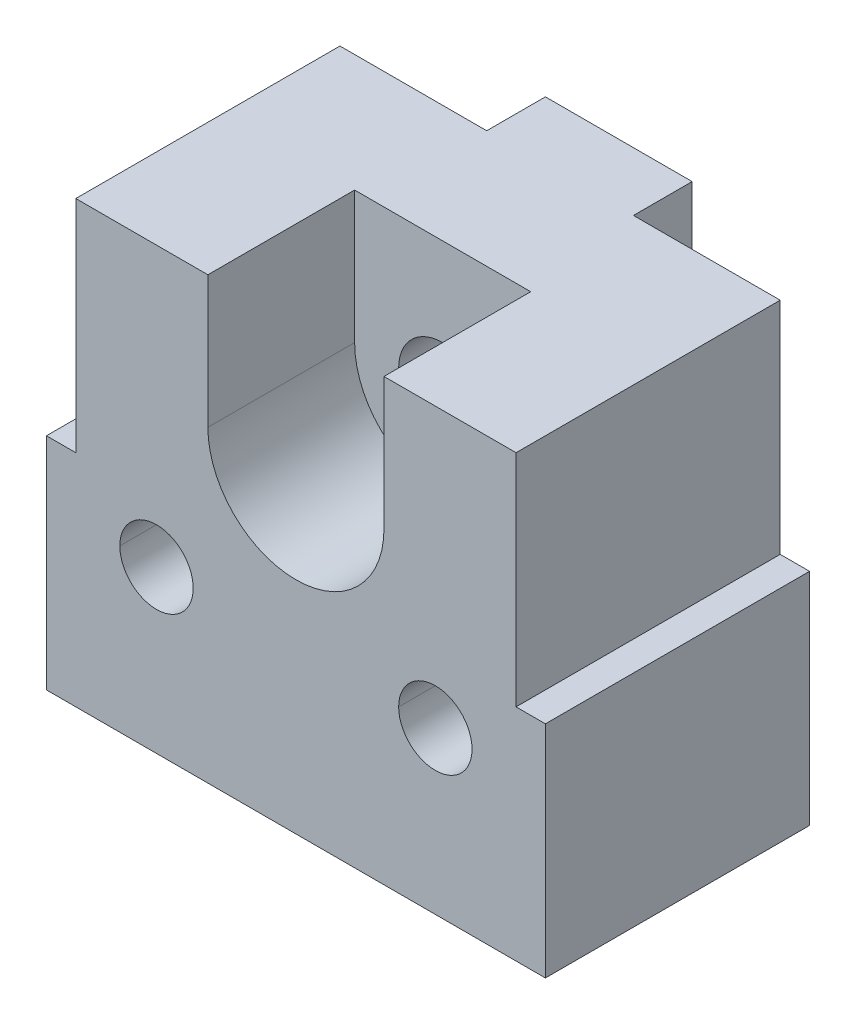
ISO-10303-21;
HEADER;
FILE_DESCRIPTION(('STEP AP214'),'2;1');
FILE_NAME('part.step','',(''),(''),'','','');
FILE_SCHEMA(('AUTOMOTIVE_DESIGN { 1 0 10303 214 1 1 1 1 }'));
ENDSEC;
DATA;
#1=APPLICATION_CONTEXT('core data for automotive mechanical design processes');
#2=APPLICATION_PROTOCOL_DEFINITION('international standard','automotive_design',2000,#1);
#3=PRODUCT_CONTEXT('',#1,'mechanical');
#4=PRODUCT('Part','Part','',(#3));
#5=PRODUCT_RELATED_PRODUCT_CATEGORY('part','',(#4));
#6=PRODUCT_DEFINITION_FORMATION('','',#4);
#7=PRODUCT_DEFINITION_CONTEXT('part definition',#1,'design');
#8=PRODUCT_DEFINITION('design','',#6,#7);
#9=PRODUCT_DEFINITION_SHAPE('','',#8);
#10=(LENGTH_UNIT() NAMED_UNIT(*) SI_UNIT(.MILLI.,.METRE.));
#11=(NAMED_UNIT(*) PLANE_ANGLE_UNIT() SI_UNIT($,.RADIAN.));
#12=(NAMED_UNIT(*) SI_UNIT($,.STERADIAN.) SOLID_ANGLE_UNIT());
#13=UNCERTAINTY_MEASURE_WITH_UNIT(LENGTH_MEASURE(1.E-05),#10,'distance_accuracy_value','');
#14=(GEOMETRIC_REPRESENTATION_CONTEXT(3) GLOBAL_UNCERTAINTY_ASSIGNED_CONTEXT((#13)) GLOBAL_UNIT_ASSIGNED_CONTEXT((#10,
#11,#12)) REPRESENTATION_CONTEXT('',''));
#15=CARTESIAN_POINT('',(0.,0.,0.));
#16=DIRECTION('',(0.,0.,1.));
#17=DIRECTION('',(1.,0.,0.));
#18=AXIS2_PLACEMENT_3D('',#15,#16,#17);
#19=CARTESIAN_POINT('',(0.,10.5,-9.));
#20=DIRECTION('',(0.,0.,1.));
#21=DIRECTION('',(1.,0.,0.));
#22=AXIS2_PLACEMENT_3D('',#19,#20,#21);
#23=CYLINDRICAL_SURFACE('',#22,1.5);
#24=CARTESIAN_POINT('',(0.,10.5,-11.));
#25=DIRECTION('',(0.,0.,1.));
#26=DIRECTION('',(1.,0.,0.));
#27=AXIS2_PLACEMENT_3D('',#24,#25,#26);
#28=CIRCLE('',#27,1.5);
#29=CARTESIAN_POINT('',(1.5,10.5,-11.));
#30=VERTEX_POINT('',#29);
#31=CARTESIAN_POINT('',(-1.5,10.5,-11.));
#32=VERTEX_POINT('',#31);
#33=EDGE_CURVE('E339',#30,#32,#28,.T.);
#34=ORIENTED_EDGE('',*,*,#33,.F.);
#35=DIRECTION('',(0.,0.,1.));
#36=VECTOR('',#35,1.);
#37=CARTESIAN_POINT('',(1.5,10.5,-9.));
#38=LINE('',#37,#36);
#39=CARTESIAN_POINT('',(1.5,10.5,-5.));
#40=VERTEX_POINT('',#39);
#41=EDGE_CURVE('E86',#30,#40,#38,.T.);
#42=ORIENTED_EDGE('',*,*,#41,.T.);
#43=CARTESIAN_POINT('',(0.,10.5,-5.));
#44=DIRECTION('',(0.,0.,1.));
#45=DIRECTION('',(1.,0.,0.));
#46=AXIS2_PLACEMENT_3D('',#43,#44,#45);
#47=CIRCLE('',#46,1.5);
#48=CARTESIAN_POINT('',(-1.5,10.5,-5.));
#49=VERTEX_POINT('',#48);
#50=EDGE_CURVE('E99',#49,#40,#47,.F.);
#51=ORIENTED_EDGE('',*,*,#50,.F.);
#52=DIRECTION('',(0.,0.,1.));
#53=VECTOR('',#52,1.);
#54=CARTESIAN_POINT('',(-1.5,10.5,-9.));
#55=LINE('',#54,#53);
#56=EDGE_CURVE('E91',#49,#32,#55,.F.);
#57=ORIENTED_EDGE('',*,*,#56,.T.);
#58=EDGE_LOOP('',(#34,#42,#51,#57));
#59=FACE_BOUND('',#58,.T.);
#60=ADVANCED_FACE('F17',(#59),#23,.F.);
#61=CARTESIAN_POINT('',(0.,10.5,-9.));
#62=DIRECTION('',(0.,0.,1.));
#63=DIRECTION('',(1.,0.,0.));
#64=AXIS2_PLACEMENT_3D('',#61,#62,#63);
#65=CYLINDRICAL_SURFACE('',#64,1.5);
#66=ORIENTED_EDGE('',*,*,#56,.F.);
#67=CARTESIAN_POINT('',(0.,10.5,-5.));
#68=DIRECTION('',(0.,0.,1.));
#69=DIRECTION('',(1.,0.,0.));
#70=AXIS2_PLACEMENT_3D('',#67,#68,#69);
#71=CIRCLE('',#70,1.5);
#72=EDGE_CURVE('E20',#40,#49,#71,.F.);
#73=ORIENTED_EDGE('',*,*,#72,.F.);
#74=ORIENTED_EDGE('',*,*,#41,.F.);
#75=CARTESIAN_POINT('',(0.,10.5,-11.));
#76=DIRECTION('',(0.,0.,1.));
#77=DIRECTION('',(1.,0.,0.));
#78=AXIS2_PLACEMENT_3D('',#75,#76,#77);
#79=CIRCLE('',#78,1.5);
#80=EDGE_CURVE('E96',#32,#30,#79,.T.);
#81=ORIENTED_EDGE('',*,*,#80,.F.);
#82=EDGE_LOOP('',(#66,#73,#74,#81));
#83=FACE_BOUND('',#82,.T.);
#84=ADVANCED_FACE('F92',(#83),#65,.F.);
#85=CARTESIAN_POINT('',(0.,10.5,-5.));
#86=DIRECTION('',(0.,0.,1.));
#87=DIRECTION('',(1.,0.,0.));
#88=AXIS2_PLACEMENT_3D('',#85,#86,#87);
#89=PLANE('',#88);
#90=DIRECTION('',(0.,1.,0.));
#91=VECTOR('',#90,1.);
#92=CARTESIAN_POINT('',(-3.,15.,-5.));
#93=LINE('',#92,#91);
#94=CARTESIAN_POINT('',(-3.,10.5,-5.));
#95=VERTEX_POINT('',#94);
#96=CARTESIAN_POINT('',(-3.,15.,-5.));
#97=VERTEX_POINT('',#96);
#98=EDGE_CURVE('E265',#95,#97,#93,.T.);
#99=ORIENTED_EDGE('',*,*,#98,.F.);
#100=CARTESIAN_POINT('',(0.,10.5,-5.));
#101=DIRECTION('',(0.,0.,1.));
#102=DIRECTION('',(1.,0.,0.));
#103=AXIS2_PLACEMENT_3D('',#100,#101,#102);
#104=CIRCLE('',#103,3.);
#105=CARTESIAN_POINT('',(3.,10.5,-5.));
#106=VERTEX_POINT('',#105);
#107=EDGE_CURVE('E280',#95,#106,#104,.T.);
#108=ORIENTED_EDGE('',*,*,#107,.T.);
#109=DIRECTION('',(0.,1.,0.));
#110=VECTOR('',#109,1.);
#111=CARTESIAN_POINT('',(3.,10.5,-5.));
#112=LINE('',#111,#110);
#113=CARTESIAN_POINT('',(3.,15.,-5.));
#114=VERTEX_POINT('',#113);
#115=EDGE_CURVE('E328',#114,#106,#112,.F.);
#116=ORIENTED_EDGE('',*,*,#115,.F.);
#117=DIRECTION('',(1.,0.,0.));
#118=VECTOR('',#117,1.);
#119=CARTESIAN_POINT('',(7.5,15.,-5.));
#120=LINE('',#119,#118);
#121=EDGE_CURVE('E275',#97,#114,#120,.T.);
#122=ORIENTED_EDGE('',*,*,#121,.F.);
#123=EDGE_LOOP('',(#99,#108,#116,#122));
#124=FACE_BOUND('',#123,.T.);
#125=ORIENTED_EDGE('',*,*,#72,.T.);
#126=ORIENTED_EDGE('',*,*,#50,.T.);
#127=EDGE_LOOP('',(#125,#126));
#128=FACE_BOUND('',#127,.T.);
#129=ADVANCED_FACE('F102',(#124,#128),#89,.T.);
#130=CARTESIAN_POINT('',(-7.5,7.50000000000001,-9.));
#131=DIRECTION('',(0.,1.,0.));
#132=DIRECTION('',(0.,0.,1.));
#133=AXIS2_PLACEMENT_3D('',#130,#131,#132);
#134=PLANE('',#133);
#135=DIRECTION('',(1.,0.,0.));
#136=VECTOR('',#135,1.);
#137=CARTESIAN_POINT('',(-7.5,7.50000000000001,0.));
#138=LINE('',#137,#136);
#139=CARTESIAN_POINT('',(-8.5,7.50000000000001,0.));
#140=VERTEX_POINT('',#139);
#141=CARTESIAN_POINT('',(-7.5,7.50000000000001,0.));
#142=VERTEX_POINT('',#141);
#143=EDGE_CURVE('E101',#140,#142,#138,.T.);
#144=ORIENTED_EDGE('',*,*,#143,.T.);
#145=DIRECTION('',(0.,0.,1.));
#146=VECTOR('',#145,1.);
#147=CARTESIAN_POINT('',(-7.5,7.50000000000001,-9.));
#148=LINE('',#147,#146);
#149=CARTESIAN_POINT('',(-7.5,7.50000000000001,-9.));
#150=VERTEX_POINT('',#149);
#151=EDGE_CURVE('E248',#150,#142,#148,.T.);
#152=ORIENTED_EDGE('',*,*,#151,.F.);
#153=DIRECTION('',(1.,0.,0.));
#154=VECTOR('',#153,1.);
#155=CARTESIAN_POINT('',(8.5,7.50000000000001,-9.));
#156=LINE('',#155,#154);
#157=CARTESIAN_POINT('',(-8.5,7.50000000000001,-9.));
#158=VERTEX_POINT('',#157);
#159=EDGE_CURVE('E307',#150,#158,#156,.F.);
#160=ORIENTED_EDGE('',*,*,#159,.T.);
#161=DIRECTION('',(0.,0.,1.));
#162=VECTOR('',#161,1.);
#163=CARTESIAN_POINT('',(-8.5,7.50000000000001,-9.));
#164=LINE('',#163,#162);
#165=EDGE_CURVE('E239',#140,#158,#164,.F.);
#166=ORIENTED_EDGE('',*,*,#165,.F.);
#167=EDGE_LOOP('',(#144,#152,#160,#166));
#168=FACE_BOUND('',#167,.T.);
#169=ADVANCED_FACE('F104',(#168),#134,.T.);
#170=CARTESIAN_POINT('',(-2.5,15.,-11.));
#171=DIRECTION('',(1.,0.,0.));
#172=DIRECTION('',(0.,1.,0.));
#173=AXIS2_PLACEMENT_3D('',#170,#171,#172);
#174=PLANE('',#173);
#175=DIRECTION('',(0.,1.,0.));
#176=VECTOR('',#175,1.);
#177=CARTESIAN_POINT('',(-2.5,0.,-11.));
#178=LINE('',#177,#176);
#179=CARTESIAN_POINT('',(-2.5,0.,-11.));
#180=VERTEX_POINT('',#179);
#181=CARTESIAN_POINT('',(-2.5,15.,-11.));
#182=VERTEX_POINT('',#181);
#183=EDGE_CURVE('E204',#180,#182,#178,.T.);
#184=ORIENTED_EDGE('',*,*,#183,.F.);
#185=DIRECTION('',(0.,0.,-1.));
#186=VECTOR('',#185,1.);
#187=CARTESIAN_POINT('',(-2.5,0.,-9.));
#188=LINE('',#187,#186);
#189=CARTESIAN_POINT('',(-2.5,0.,-9.));
#190=VERTEX_POINT('',#189);
#191=EDGE_CURVE('E209',#190,#180,#188,.T.);
#192=ORIENTED_EDGE('',*,*,#191,.F.);
#193=DIRECTION('',(0.,1.,0.));
#194=VECTOR('',#193,1.);
#195=CARTESIAN_POINT('',(-2.5,7.50000000000001,-9.));
#196=LINE('',#195,#194);
#197=CARTESIAN_POINT('',(-2.5,15.,-9.));
#198=VERTEX_POINT('',#197);
#199=EDGE_CURVE('E311',#190,#198,#196,.T.);
#200=ORIENTED_EDGE('',*,*,#199,.T.);
#201=DIRECTION('',(0.,0.,1.));
#202=VECTOR('',#201,1.);
#203=CARTESIAN_POINT('',(-2.5,15.,-9.));
#204=LINE('',#203,#202);
#205=EDGE_CURVE('E213',#182,#198,#204,.T.);
#206=ORIENTED_EDGE('',*,*,#205,.F.);
#207=EDGE_LOOP('',(#184,#192,#200,#206));
#208=FACE_BOUND('',#207,.T.);
#209=ADVANCED_FACE('F112',(#208),#174,.F.);
#210=CARTESIAN_POINT('',(2.5,0.,-11.));
#211=DIRECTION('',(0.,0.,-1.));
#212=DIRECTION('',(-1.,0.,0.));
#213=AXIS2_PLACEMENT_3D('',#210,#211,#212);
#214=PLANE('',#213);
#215=DIRECTION('',(0.,-1.,0.));
#216=VECTOR('',#215,1.);
#217=CARTESIAN_POINT('',(2.5,15.,-11.));
#218=LINE('',#217,#216);
#219=CARTESIAN_POINT('',(2.5,15.,-11.));
#220=VERTEX_POINT('',#219);
#221=CARTESIAN_POINT('',(2.5,0.,-11.));
#222=VERTEX_POINT('',#221);
#223=EDGE_CURVE('E218',#220,#222,#218,.T.);
#224=ORIENTED_EDGE('',*,*,#223,.T.);
#225=DIRECTION('',(1.,0.,0.));
#226=VECTOR('',#225,1.);
#227=CARTESIAN_POINT('',(8.5,0.,-11.));
#228=LINE('',#227,#226);
#229=EDGE_CURVE('E222',#180,#222,#228,.T.);
#230=ORIENTED_EDGE('',*,*,#229,.F.);
#231=ORIENTED_EDGE('',*,*,#183,.T.);
#232=DIRECTION('',(1.,0.,0.));
#233=VECTOR('',#232,1.);
#234=CARTESIAN_POINT('',(7.5,15.,-11.));
#235=LINE('',#234,#233);
#236=EDGE_CURVE('E255',#220,#182,#235,.F.);
#237=ORIENTED_EDGE('',*,*,#236,.F.);
#238=EDGE_LOOP('',(#224,#230,#231,#237));
#239=FACE_BOUND('',#238,.T.);
#240=ORIENTED_EDGE('',*,*,#33,.T.);
#241=ORIENTED_EDGE('',*,*,#80,.T.);
#242=EDGE_LOOP('',(#240,#241));
#243=FACE_BOUND('',#242,.T.);
#244=ADVANCED_FACE('F190',(#239,#243),#214,.T.);
#245=CARTESIAN_POINT('',(2.5,15.,-11.));
#246=DIRECTION('',(-1.,0.,0.));
#247=DIRECTION('',(0.,-1.,0.));
#248=AXIS2_PLACEMENT_3D('',#245,#246,#247);
#249=PLANE('',#248);
#250=ORIENTED_EDGE('',*,*,#223,.F.);
#251=DIRECTION('',(0.,0.,1.));
#252=VECTOR('',#251,1.);
#253=CARTESIAN_POINT('',(2.5,15.,-9.));
#254=LINE('',#253,#252);
#255=CARTESIAN_POINT('',(2.5,15.,-9.));
#256=VERTEX_POINT('',#255);
#257=EDGE_CURVE('E257',#256,#220,#254,.F.);
#258=ORIENTED_EDGE('',*,*,#257,.F.);
#259=DIRECTION('',(0.,1.,0.));
#260=VECTOR('',#259,1.);
#261=CARTESIAN_POINT('',(2.5,7.50000000000001,-9.));
#262=LINE('',#261,#260);
#263=CARTESIAN_POINT('',(2.5,0.,-9.));
#264=VERTEX_POINT('',#263);
#265=EDGE_CURVE('E310',#256,#264,#262,.F.);
#266=ORIENTED_EDGE('',*,*,#265,.T.);
#267=DIRECTION('',(0.,0.,-1.));
#268=VECTOR('',#267,1.);
#269=CARTESIAN_POINT('',(2.5,0.,-9.));
#270=LINE('',#269,#268);
#271=EDGE_CURVE('E227',#222,#264,#270,.F.);
#272=ORIENTED_EDGE('',*,*,#271,.F.);
#273=EDGE_LOOP('',(#250,#258,#266,#272));
#274=FACE_BOUND('',#273,.T.);
#275=ADVANCED_FACE('F186',(#274),#249,.F.);
#276=CARTESIAN_POINT('',(8.5,7.50000000000001,-9.));
#277=DIRECTION('',(0.,1.,0.));
#278=DIRECTION('',(0.,0.,1.));
#279=AXIS2_PLACEMENT_3D('',#276,#277,#278);
#280=PLANE('',#279);
#281=DIRECTION('',(1.,0.,0.));
#282=VECTOR('',#281,1.);
#283=CARTESIAN_POINT('',(8.5,7.50000000000001,0.));
#284=LINE('',#283,#282);
#285=CARTESIAN_POINT('',(7.5,7.50000000000001,0.));
#286=VERTEX_POINT('',#285);
#287=CARTESIAN_POINT('',(8.5,7.50000000000001,0.));
#288=VERTEX_POINT('',#287);
#289=EDGE_CURVE('E313',#286,#288,#284,.T.);
#290=ORIENTED_EDGE('',*,*,#289,.T.);
#291=DIRECTION('',(0.,0.,-1.));
#292=VECTOR('',#291,1.);
#293=CARTESIAN_POINT('',(8.5,7.50000000000001,-9.));
#294=LINE('',#293,#292);
#295=CARTESIAN_POINT('',(8.5,7.50000000000001,-9.));
#296=VERTEX_POINT('',#295);
#297=EDGE_CURVE('E360',#296,#288,#294,.F.);
#298=ORIENTED_EDGE('',*,*,#297,.F.);
#299=DIRECTION('',(1.,0.,0.));
#300=VECTOR('',#299,1.);
#301=CARTESIAN_POINT('',(8.5,7.50000000000001,-9.));
#302=LINE('',#301,#300);
#303=CARTESIAN_POINT('',(7.5,7.5,-9.));
#304=VERTEX_POINT('',#303);
#305=EDGE_CURVE('E325',#296,#304,#302,.F.);
#306=ORIENTED_EDGE('',*,*,#305,.T.);
#307=DIRECTION('',(0.,0.,-1.));
#308=VECTOR('',#307,1.);
#309=CARTESIAN_POINT('',(7.5,7.50000000000001,-9.));
#310=LINE('',#309,#308);
#311=EDGE_CURVE('E296',#286,#304,#310,.T.);
#312=ORIENTED_EDGE('',*,*,#311,.F.);
#313=EDGE_LOOP('',(#290,#298,#306,#312));
#314=FACE_BOUND('',#313,.T.);
#315=ADVANCED_FACE('F182',(#314),#280,.T.);
#316=CARTESIAN_POINT('',(8.5,7.50000000000001,-9.));
#317=DIRECTION('',(0.,0.,1.));
#318=DIRECTION('',(1.,0.,0.));
#319=AXIS2_PLACEMENT_3D('',#316,#317,#318);
#320=PLANE('',#319);
#321=CARTESIAN_POINT('',(-4.75,5.50000000000001,-9.));
#322=DIRECTION('',(0.,0.,1.));
#323=DIRECTION('',(1.,0.,0.));
#324=AXIS2_PLACEMENT_3D('',#321,#322,#323);
#325=CIRCLE('',#324,1.25);
#326=CARTESIAN_POINT('',(-6.,5.50000000000001,-9.));
#327=VERTEX_POINT('',#326);
#328=CARTESIAN_POINT('',(-3.5,5.50000000000001,-9.));
#329=VERTEX_POINT('',#328);
#330=EDGE_CURVE('E333',#327,#329,#325,.T.);
#331=ORIENTED_EDGE('',*,*,#330,.T.);
#332=CARTESIAN_POINT('',(-4.75,5.50000000000001,-9.));
#333=DIRECTION('',(0.,0.,1.));
#334=DIRECTION('',(1.,0.,0.));
#335=AXIS2_PLACEMENT_3D('',#332,#333,#334);
#336=CIRCLE('',#335,1.25);
#337=EDGE_CURVE('E393',#329,#327,#336,.T.);
#338=ORIENTED_EDGE('',*,*,#337,.T.);
#339=EDGE_LOOP('',(#331,#338));
#340=FACE_BOUND('',#339,.T.);
#341=DIRECTION('',(0.,1.,0.));
#342=VECTOR('',#341,1.);
#343=CARTESIAN_POINT('',(-8.5,0.,-9.));
#344=LINE('',#343,#342);
#345=CARTESIAN_POINT('',(-8.5,0.,-9.));
#346=VERTEX_POINT('',#345);
#347=EDGE_CURVE('E242',#158,#346,#344,.F.);
#348=ORIENTED_EDGE('',*,*,#347,.F.);
#349=ORIENTED_EDGE('',*,*,#159,.F.);
#350=DIRECTION('',(0.,1.,0.));
#351=VECTOR('',#350,1.);
#352=CARTESIAN_POINT('',(-7.5,15.,-9.));
#353=LINE('',#352,#351);
#354=CARTESIAN_POINT('',(-7.5,15.,-9.));
#355=VERTEX_POINT('',#354);
#356=EDGE_CURVE('E251',#355,#150,#353,.F.);
#357=ORIENTED_EDGE('',*,*,#356,.F.);
#358=DIRECTION('',(1.,0.,0.));
#359=VECTOR('',#358,1.);
#360=CARTESIAN_POINT('',(7.5,15.,-9.));
#361=LINE('',#360,#359);
#362=EDGE_CURVE('E258',#198,#355,#361,.F.);
#363=ORIENTED_EDGE('',*,*,#362,.F.);
#364=ORIENTED_EDGE('',*,*,#199,.F.);
#365=DIRECTION('',(1.,0.,0.));
#366=VECTOR('',#365,1.);
#367=CARTESIAN_POINT('',(8.5,0.,-9.));
#368=LINE('',#367,#366);
#369=EDGE_CURVE('E231',#346,#190,#368,.T.);
#370=ORIENTED_EDGE('',*,*,#369,.F.);
#371=EDGE_LOOP('',(#348,#349,#357,#363,#364,#370));
#372=FACE_BOUND('',#371,.T.);
#373=ADVANCED_FACE('F178',(#340,#372),#320,.F.);
#374=CARTESIAN_POINT('',(8.5,7.50000000000001,-9.));
#375=DIRECTION('',(0.,0.,1.));
#376=DIRECTION('',(1.,0.,0.));
#377=AXIS2_PLACEMENT_3D('',#374,#375,#376);
#378=PLANE('',#377);
#379=CARTESIAN_POINT('',(4.75,5.50000000000001,-9.));
#380=DIRECTION('',(0.,0.,1.));
#381=DIRECTION('',(1.,0.,0.));
#382=AXIS2_PLACEMENT_3D('',#379,#380,#381);
#383=CIRCLE('',#382,1.25);
#384=CARTESIAN_POINT('',(3.5,5.50000000000001,-9.));
#385=VERTEX_POINT('',#384);
#386=CARTESIAN_POINT('',(6.,5.50000000000001,-9.));
#387=VERTEX_POINT('',#386);
#388=EDGE_CURVE('E390',#385,#387,#383,.T.);
#389=ORIENTED_EDGE('',*,*,#388,.T.);
#390=CARTESIAN_POINT('',(4.75,5.50000000000001,-9.));
#391=DIRECTION('',(0.,0.,1.));
#392=DIRECTION('',(1.,0.,0.));
#393=AXIS2_PLACEMENT_3D('',#390,#391,#392);
#394=CIRCLE('',#393,1.25);
#395=EDGE_CURVE('E387',#387,#385,#394,.T.);
#396=ORIENTED_EDGE('',*,*,#395,.T.);
#397=EDGE_LOOP('',(#389,#396));
#398=FACE_BOUND('',#397,.T.);
#399=DIRECTION('',(0.,1.,0.));
#400=VECTOR('',#399,1.);
#401=CARTESIAN_POINT('',(7.5,15.,-9.));
#402=LINE('',#401,#400);
#403=CARTESIAN_POINT('',(7.5,15.,-9.));
#404=VERTEX_POINT('',#403);
#405=EDGE_CURVE('E297',#304,#404,#402,.T.);
#406=ORIENTED_EDGE('',*,*,#405,.F.);
#407=ORIENTED_EDGE('',*,*,#305,.F.);
#408=DIRECTION('',(0.,1.,0.));
#409=VECTOR('',#408,1.);
#410=CARTESIAN_POINT('',(8.5,0.,-9.));
#411=LINE('',#410,#409);
#412=CARTESIAN_POINT('',(8.5,0.,-9.));
#413=VERTEX_POINT('',#412);
#414=EDGE_CURVE('E363',#413,#296,#411,.T.);
#415=ORIENTED_EDGE('',*,*,#414,.F.);
#416=DIRECTION('',(1.,0.,0.));
#417=VECTOR('',#416,1.);
#418=CARTESIAN_POINT('',(8.5,0.,-9.));
#419=LINE('',#418,#417);
#420=EDGE_CURVE('E238',#264,#413,#419,.T.);
#421=ORIENTED_EDGE('',*,*,#420,.F.);
#422=ORIENTED_EDGE('',*,*,#265,.F.);
#423=DIRECTION('',(1.,0.,0.));
#424=VECTOR('',#423,1.);
#425=CARTESIAN_POINT('',(7.5,15.,-9.));
#426=LINE('',#425,#424);
#427=EDGE_CURVE('E290',#404,#256,#426,.F.);
#428=ORIENTED_EDGE('',*,*,#427,.F.);
#429=EDGE_LOOP('',(#406,#407,#415,#421,#422,#428));
#430=FACE_BOUND('',#429,.T.);
#431=ADVANCED_FACE('F174',(#398,#430),#378,.F.);
#432=CARTESIAN_POINT('',(3.,10.5,-5.));
#433=DIRECTION('',(-1.,0.,0.));
#434=DIRECTION('',(0.,0.,1.));
#435=AXIS2_PLACEMENT_3D('',#432,#433,#434);
#436=PLANE('',#435);
#437=DIRECTION('',(0.,1.,0.));
#438=VECTOR('',#437,1.);
#439=CARTESIAN_POINT('',(3.,7.50000000000001,0.));
#440=LINE('',#439,#438);
#441=CARTESIAN_POINT('',(3.,15.,0.));
#442=VERTEX_POINT('',#441);
#443=CARTESIAN_POINT('',(3.,10.5,0.));
#444=VERTEX_POINT('',#443);
#445=EDGE_CURVE('E284',#442,#444,#440,.F.);
#446=ORIENTED_EDGE('',*,*,#445,.F.);
#447=DIRECTION('',(0.,0.,1.));
#448=VECTOR('',#447,1.);
#449=CARTESIAN_POINT('',(3.,15.,-9.));
#450=LINE('',#449,#448);
#451=EDGE_CURVE('E287',#114,#442,#450,.T.);
#452=ORIENTED_EDGE('',*,*,#451,.F.);
#453=ORIENTED_EDGE('',*,*,#115,.T.);
#454=DIRECTION('',(0.,0.,1.));
#455=VECTOR('',#454,1.);
#456=CARTESIAN_POINT('',(3.,10.5,-5.));
#457=LINE('',#456,#455);
#458=EDGE_CURVE('E278',#106,#444,#457,.T.);
#459=ORIENTED_EDGE('',*,*,#458,.T.);
#460=EDGE_LOOP('',(#446,#452,#453,#459));
#461=FACE_BOUND('',#460,.T.);
#462=ADVANCED_FACE('F170',(#461),#436,.T.);
#463=CARTESIAN_POINT('',(0.,10.5,-5.));
#464=DIRECTION('',(0.,0.,1.));
#465=DIRECTION('',(1.,0.,0.));
#466=AXIS2_PLACEMENT_3D('',#463,#464,#465);
#467=CYLINDRICAL_SURFACE('',#466,3.);
#468=ORIENTED_EDGE('',*,*,#107,.F.);
#469=DIRECTION('',(0.,0.,1.));
#470=VECTOR('',#469,1.);
#471=CARTESIAN_POINT('',(-3.,10.5,-5.));
#472=LINE('',#471,#470);
#473=CARTESIAN_POINT('',(-3.,10.5,0.));
#474=VERTEX_POINT('',#473);
#475=EDGE_CURVE('E262',#474,#95,#472,.F.);
#476=ORIENTED_EDGE('',*,*,#475,.F.);
#477=CARTESIAN_POINT('',(0.,10.5,0.));
#478=DIRECTION('',(0.,0.,1.));
#479=DIRECTION('',(1.,0.,0.));
#480=AXIS2_PLACEMENT_3D('',#477,#478,#479);
#481=CIRCLE('',#480,3.);
#482=EDGE_CURVE('E384',#444,#474,#481,.F.);
#483=ORIENTED_EDGE('',*,*,#482,.F.);
#484=ORIENTED_EDGE('',*,*,#458,.F.);
#485=EDGE_LOOP('',(#468,#476,#483,#484));
#486=FACE_BOUND('',#485,.T.);
#487=ADVANCED_FACE('F166',(#486),#467,.F.);
#488=CARTESIAN_POINT('',(-3.,15.,-5.));
#489=DIRECTION('',(1.,0.,0.));
#490=DIRECTION('',(0.,1.,0.));
#491=AXIS2_PLACEMENT_3D('',#488,#489,#490);
#492=PLANE('',#491);
#493=DIRECTION('',(0.,1.,0.));
#494=VECTOR('',#493,1.);
#495=CARTESIAN_POINT('',(-3.,7.50000000000001,0.));
#496=LINE('',#495,#494);
#497=CARTESIAN_POINT('',(-3.,15.,0.));
#498=VERTEX_POINT('',#497);
#499=EDGE_CURVE('E270',#474,#498,#496,.T.);
#500=ORIENTED_EDGE('',*,*,#499,.F.);
#501=ORIENTED_EDGE('',*,*,#475,.T.);
#502=ORIENTED_EDGE('',*,*,#98,.T.);
#503=DIRECTION('',(0.,0.,1.));
#504=VECTOR('',#503,1.);
#505=CARTESIAN_POINT('',(-3.,15.,-9.));
#506=LINE('',#505,#504);
#507=EDGE_CURVE('E261',#498,#97,#506,.F.);
#508=ORIENTED_EDGE('',*,*,#507,.F.);
#509=EDGE_LOOP('',(#500,#501,#502,#508));
#510=FACE_BOUND('',#509,.T.);
#511=ADVANCED_FACE('F162',(#510),#492,.T.);
#512=CARTESIAN_POINT('',(7.5,15.,-9.));
#513=DIRECTION('',(0.,1.,0.));
#514=DIRECTION('',(0.,0.,1.));
#515=AXIS2_PLACEMENT_3D('',#512,#513,#514);
#516=PLANE('',#515);
#517=ORIENTED_EDGE('',*,*,#236,.T.);
#518=ORIENTED_EDGE('',*,*,#205,.T.);
#519=ORIENTED_EDGE('',*,*,#362,.T.);
#520=DIRECTION('',(0.,0.,1.));
#521=VECTOR('',#520,1.);
#522=CARTESIAN_POINT('',(-7.5,15.,-9.));
#523=LINE('',#522,#521);
#524=CARTESIAN_POINT('',(-7.5,15.,0.));
#525=VERTEX_POINT('',#524);
#526=EDGE_CURVE('E245',#525,#355,#523,.F.);
#527=ORIENTED_EDGE('',*,*,#526,.F.);
#528=DIRECTION('',(1.,0.,0.));
#529=VECTOR('',#528,1.);
#530=CARTESIAN_POINT('',(8.5,15.,0.));
#531=LINE('',#530,#529);
#532=EDGE_CURVE('E266',#498,#525,#531,.F.);
#533=ORIENTED_EDGE('',*,*,#532,.F.);
#534=ORIENTED_EDGE('',*,*,#507,.T.);
#535=ORIENTED_EDGE('',*,*,#121,.T.);
#536=ORIENTED_EDGE('',*,*,#451,.T.);
#537=DIRECTION('',(1.,0.,0.));
#538=VECTOR('',#537,1.);
#539=CARTESIAN_POINT('',(8.5,15.,0.));
#540=LINE('',#539,#538);
#541=CARTESIAN_POINT('',(7.5,15.,0.));
#542=VERTEX_POINT('',#541);
#543=EDGE_CURVE('E281',#542,#442,#540,.F.);
#544=ORIENTED_EDGE('',*,*,#543,.F.);
#545=DIRECTION('',(0.,0.,-1.));
#546=VECTOR('',#545,1.);
#547=CARTESIAN_POINT('',(7.5,15.,-9.));
#548=LINE('',#547,#546);
#549=EDGE_CURVE('E293',#404,#542,#548,.F.);
#550=ORIENTED_EDGE('',*,*,#549,.F.);
#551=ORIENTED_EDGE('',*,*,#427,.T.);
#552=ORIENTED_EDGE('',*,*,#257,.T.);
#553=EDGE_LOOP('',(#517,#518,#519,#527,#533,#534,#535,#536,#544,#550,#551,#552));
#554=FACE_BOUND('',#553,.T.);
#555=ADVANCED_FACE('F158',(#554),#516,.T.);
#556=CARTESIAN_POINT('',(-7.5,15.,-9.));
#557=DIRECTION('',(-1.,0.,0.));
#558=DIRECTION('',(0.,0.,1.));
#559=AXIS2_PLACEMENT_3D('',#556,#557,#558);
#560=PLANE('',#559);
#561=DIRECTION('',(0.,1.,0.));
#562=VECTOR('',#561,1.);
#563=CARTESIAN_POINT('',(-7.5,7.50000000000001,0.));
#564=LINE('',#563,#562);
#565=EDGE_CURVE('E269',#525,#142,#564,.F.);
#566=ORIENTED_EDGE('',*,*,#565,.F.);
#567=ORIENTED_EDGE('',*,*,#526,.T.);
#568=ORIENTED_EDGE('',*,*,#356,.T.);
#569=ORIENTED_EDGE('',*,*,#151,.T.);
#570=EDGE_LOOP('',(#566,#567,#568,#569));
#571=FACE_BOUND('',#570,.T.);
#572=ADVANCED_FACE('F154',(#571),#560,.T.);
#573=CARTESIAN_POINT('',(-8.5,0.,-9.));
#574=DIRECTION('',(-1.,0.,0.));
#575=DIRECTION('',(0.,0.,1.));
#576=AXIS2_PLACEMENT_3D('',#573,#574,#575);
#577=PLANE('',#576);
#578=DIRECTION('',(0.,1.,0.));
#579=VECTOR('',#578,1.);
#580=CARTESIAN_POINT('',(-8.5,7.50000000000001,0.));
#581=LINE('',#580,#579);
#582=CARTESIAN_POINT('',(-8.5,0.,0.));
#583=VERTEX_POINT('',#582);
#584=EDGE_CURVE('E496',#140,#583,#581,.F.);
#585=ORIENTED_EDGE('',*,*,#584,.F.);
#586=ORIENTED_EDGE('',*,*,#165,.T.);
#587=ORIENTED_EDGE('',*,*,#347,.T.);
#588=DIRECTION('',(0.,0.,-1.));
#589=VECTOR('',#588,1.);
#590=CARTESIAN_POINT('',(-8.5,0.,-9.));
#591=LINE('',#590,#589);
#592=EDGE_CURVE('E233',#583,#346,#591,.T.);
#593=ORIENTED_EDGE('',*,*,#592,.F.);
#594=EDGE_LOOP('',(#585,#586,#587,#593));
#595=FACE_BOUND('',#594,.T.);
#596=ADVANCED_FACE('F150',(#595),#577,.T.);
#597=CARTESIAN_POINT('',(8.5,0.,-9.));
#598=DIRECTION('',(0.,-1.,0.));
#599=DIRECTION('',(0.,0.,-1.));
#600=AXIS2_PLACEMENT_3D('',#597,#598,#599);
#601=PLANE('',#600);
#602=ORIENTED_EDGE('',*,*,#229,.T.);
#603=ORIENTED_EDGE('',*,*,#271,.T.);
#604=ORIENTED_EDGE('',*,*,#420,.T.);
#605=DIRECTION('',(0.,0.,-1.));
#606=VECTOR('',#605,1.);
#607=CARTESIAN_POINT('',(8.5,0.,-9.));
#608=LINE('',#607,#606);
#609=CARTESIAN_POINT('',(8.5,0.,0.));
#610=VERTEX_POINT('',#609);
#611=EDGE_CURVE('E322',#610,#413,#608,.T.);
#612=ORIENTED_EDGE('',*,*,#611,.F.);
#613=DIRECTION('',(1.,0.,0.));
#614=VECTOR('',#613,1.);
#615=CARTESIAN_POINT('',(8.5,0.,0.));
#616=LINE('',#615,#614);
#617=EDGE_CURVE('E437',#583,#610,#616,.T.);
#618=ORIENTED_EDGE('',*,*,#617,.F.);
#619=ORIENTED_EDGE('',*,*,#592,.T.);
#620=ORIENTED_EDGE('',*,*,#369,.T.);
#621=ORIENTED_EDGE('',*,*,#191,.T.);
#622=EDGE_LOOP('',(#602,#603,#604,#612,#618,#619,#620,#621));
#623=FACE_BOUND('',#622,.T.);
#624=ADVANCED_FACE('F146',(#623),#601,.T.);
#625=CARTESIAN_POINT('',(8.5,0.,-9.));
#626=DIRECTION('',(1.,0.,0.));
#627=DIRECTION('',(0.,0.,-1.));
#628=AXIS2_PLACEMENT_3D('',#625,#626,#627);
#629=PLANE('',#628);
#630=DIRECTION('',(0.,1.,0.));
#631=VECTOR('',#630,1.);
#632=CARTESIAN_POINT('',(8.5,7.50000000000001,0.));
#633=LINE('',#632,#631);
#634=EDGE_CURVE('E304',#610,#288,#633,.T.);
#635=ORIENTED_EDGE('',*,*,#634,.F.);
#636=ORIENTED_EDGE('',*,*,#611,.T.);
#637=ORIENTED_EDGE('',*,*,#414,.T.);
#638=ORIENTED_EDGE('',*,*,#297,.T.);
#639=EDGE_LOOP('',(#635,#636,#637,#638));
#640=FACE_BOUND('',#639,.T.);
#641=ADVANCED_FACE('F142',(#640),#629,.T.);
#642=CARTESIAN_POINT('',(7.5,15.,-9.));
#643=DIRECTION('',(1.,0.,0.));
#644=DIRECTION('',(0.,0.,-1.));
#645=AXIS2_PLACEMENT_3D('',#642,#643,#644);
#646=PLANE('',#645);
#647=DIRECTION('',(0.,1.,0.));
#648=VECTOR('',#647,1.);
#649=CARTESIAN_POINT('',(7.5,7.50000000000001,0.));
#650=LINE('',#649,#648);
#651=EDGE_CURVE('E300',#286,#542,#650,.T.);
#652=ORIENTED_EDGE('',*,*,#651,.F.);
#653=ORIENTED_EDGE('',*,*,#311,.T.);
#654=ORIENTED_EDGE('',*,*,#405,.T.);
#655=ORIENTED_EDGE('',*,*,#549,.T.);
#656=EDGE_LOOP('',(#652,#653,#654,#655));
#657=FACE_BOUND('',#656,.T.);
#658=ADVANCED_FACE('F138',(#657),#646,.T.);
#659=CARTESIAN_POINT('',(-4.75,5.50000000000001,-9.));
#660=DIRECTION('',(0.,0.,1.));
#661=DIRECTION('',(1.,0.,0.));
#662=AXIS2_PLACEMENT_3D('',#659,#660,#661);
#663=CYLINDRICAL_SURFACE('',#662,1.25);
#664=DIRECTION('',(0.,0.,1.));
#665=VECTOR('',#664,1.);
#666=CARTESIAN_POINT('',(-6.,5.50000000000001,-9.));
#667=LINE('',#666,#665);
#668=CARTESIAN_POINT('',(-6.,5.50000000000001,0.));
#669=VERTEX_POINT('',#668);
#670=EDGE_CURVE('E392',#327,#669,#667,.T.);
#671=ORIENTED_EDGE('',*,*,#670,.T.);
#672=CARTESIAN_POINT('',(-4.75,5.50000000000001,0.));
#673=DIRECTION('',(0.,0.,1.));
#674=DIRECTION('',(1.,0.,0.));
#675=AXIS2_PLACEMENT_3D('',#672,#673,#674);
#676=CIRCLE('',#675,1.25);
#677=CARTESIAN_POINT('',(-3.5,5.50000000000001,0.));
#678=VERTEX_POINT('',#677);
#679=EDGE_CURVE('E303',#678,#669,#676,.F.);
#680=ORIENTED_EDGE('',*,*,#679,.F.);
#681=DIRECTION('',(0.,0.,1.));
#682=VECTOR('',#681,1.);
#683=CARTESIAN_POINT('',(-3.5,5.50000000000001,-9.));
#684=LINE('',#683,#682);
#685=EDGE_CURVE('E395',#678,#329,#684,.F.);
#686=ORIENTED_EDGE('',*,*,#685,.T.);
#687=ORIENTED_EDGE('',*,*,#330,.F.);
#688=EDGE_LOOP('',(#671,#680,#686,#687));
#689=FACE_BOUND('',#688,.T.);
#690=ADVANCED_FACE('F134',(#689),#663,.F.);
#691=CARTESIAN_POINT('',(-4.75,5.50000000000001,-9.));
#692=DIRECTION('',(0.,0.,1.));
#693=DIRECTION('',(1.,0.,0.));
#694=AXIS2_PLACEMENT_3D('',#691,#692,#693);
#695=CYLINDRICAL_SURFACE('',#694,1.25);
#696=ORIENTED_EDGE('',*,*,#337,.F.);
#697=ORIENTED_EDGE('',*,*,#685,.F.);
#698=CARTESIAN_POINT('',(-4.75,5.50000000000001,0.));
#699=DIRECTION('',(0.,0.,1.));
#700=DIRECTION('',(1.,0.,0.));
#701=AXIS2_PLACEMENT_3D('',#698,#699,#700);
#702=CIRCLE('',#701,1.25);
#703=EDGE_CURVE('E379',#669,#678,#702,.F.);
#704=ORIENTED_EDGE('',*,*,#703,.F.);
#705=ORIENTED_EDGE('',*,*,#670,.F.);
#706=EDGE_LOOP('',(#696,#697,#704,#705));
#707=FACE_BOUND('',#706,.T.);
#708=ADVANCED_FACE('F131',(#707),#695,.F.);
#709=CARTESIAN_POINT('',(4.75,5.50000000000001,-9.));
#710=DIRECTION('',(0.,0.,1.));
#711=DIRECTION('',(1.,0.,0.));
#712=AXIS2_PLACEMENT_3D('',#709,#710,#711);
#713=CYLINDRICAL_SURFACE('',#712,1.25);
#714=DIRECTION('',(0.,0.,1.));
#715=VECTOR('',#714,1.);
#716=CARTESIAN_POINT('',(3.5,5.50000000000001,-9.));
#717=LINE('',#716,#715);
#718=CARTESIAN_POINT('',(3.5,5.50000000000001,0.));
#719=VERTEX_POINT('',#718);
#720=EDGE_CURVE('E35',#385,#719,#717,.T.);
#721=ORIENTED_EDGE('',*,*,#720,.T.);
#722=CARTESIAN_POINT('',(4.75,5.50000000000001,0.));
#723=DIRECTION('',(0.,0.,1.));
#724=DIRECTION('',(1.,0.,0.));
#725=AXIS2_PLACEMENT_3D('',#722,#723,#724);
#726=CIRCLE('',#725,1.25);
#727=CARTESIAN_POINT('',(6.,5.50000000000001,0.));
#728=VERTEX_POINT('',#727);
#729=EDGE_CURVE('E26',#728,#719,#726,.F.);
#730=ORIENTED_EDGE('',*,*,#729,.F.);
#731=DIRECTION('',(0.,0.,1.));
#732=VECTOR('',#731,1.);
#733=CARTESIAN_POINT('',(6.,5.50000000000001,-9.));
#734=LINE('',#733,#732);
#735=EDGE_CURVE('E389',#728,#387,#734,.F.);
#736=ORIENTED_EDGE('',*,*,#735,.T.);
#737=ORIENTED_EDGE('',*,*,#388,.F.);
#738=EDGE_LOOP('',(#721,#730,#736,#737));
#739=FACE_BOUND('',#738,.T.);
#740=ADVANCED_FACE('F123',(#739),#713,.F.);
#741=CARTESIAN_POINT('',(4.75,5.50000000000001,-9.));
#742=DIRECTION('',(0.,0.,1.));
#743=DIRECTION('',(1.,0.,0.));
#744=AXIS2_PLACEMENT_3D('',#741,#742,#743);
#745=CYLINDRICAL_SURFACE('',#744,1.25);
#746=ORIENTED_EDGE('',*,*,#395,.F.);
#747=ORIENTED_EDGE('',*,*,#735,.F.);
#748=CARTESIAN_POINT('',(4.75,5.50000000000001,0.));
#749=DIRECTION('',(0.,0.,1.));
#750=DIRECTION('',(1.,0.,0.));
#751=AXIS2_PLACEMENT_3D('',#748,#749,#750);
#752=CIRCLE('',#751,1.25);
#753=EDGE_CURVE('E11',#719,#728,#752,.F.);
#754=ORIENTED_EDGE('',*,*,#753,.F.);
#755=ORIENTED_EDGE('',*,*,#720,.F.);
#756=EDGE_LOOP('',(#746,#747,#754,#755));
#757=FACE_BOUND('',#756,.T.);
#758=ADVANCED_FACE('F117',(#757),#745,.F.);
#759=CARTESIAN_POINT('',(8.5,7.50000000000001,0.));
#760=DIRECTION('',(0.,0.,1.));
#761=DIRECTION('',(1.,0.,0.));
#762=AXIS2_PLACEMENT_3D('',#759,#760,#761);
#763=PLANE('',#762);
#764=ORIENTED_EDGE('',*,*,#729,.T.);
#765=ORIENTED_EDGE('',*,*,#753,.T.);
#766=EDGE_LOOP('',(#764,#765));
#767=FACE_BOUND('',#766,.T.);
#768=ORIENTED_EDGE('',*,*,#679,.T.);
#769=ORIENTED_EDGE('',*,*,#703,.T.);
#770=EDGE_LOOP('',(#768,#769));
#771=FACE_BOUND('',#770,.T.);
#772=ORIENTED_EDGE('',*,*,#289,.F.);
#773=ORIENTED_EDGE('',*,*,#651,.T.);
#774=ORIENTED_EDGE('',*,*,#543,.T.);
#775=ORIENTED_EDGE('',*,*,#445,.T.);
#776=ORIENTED_EDGE('',*,*,#482,.T.);
#777=ORIENTED_EDGE('',*,*,#499,.T.);
#778=ORIENTED_EDGE('',*,*,#532,.T.);
#779=ORIENTED_EDGE('',*,*,#565,.T.);
#780=ORIENTED_EDGE('',*,*,#143,.F.);
#781=ORIENTED_EDGE('',*,*,#584,.T.);
#782=ORIENTED_EDGE('',*,*,#617,.T.);
#783=ORIENTED_EDGE('',*,*,#634,.T.);
#784=EDGE_LOOP('',(#772,#773,#774,#775,#776,#777,#778,#779,#780,#781,#782,#783));
#785=FACE_BOUND('',#784,.T.);
#786=ADVANCED_FACE('F115',(#767,#771,#785),#763,.T.);
#787=CLOSED_SHELL('',(#60,#84,#129,#169,#209,#244,#275,#315,#373,#431,#462,#487,#511,#555,#572,
#596,#624,#641,#658,#690,#708,#740,#758,#786));
#788=MANIFOLD_SOLID_BREP('B1',#787);
#789=ADVANCED_BREP_SHAPE_REPRESENTATION('',(#18,#788),#14);
#790=SHAPE_DEFINITION_REPRESENTATION(#9,#789);
ENDSEC;
END-ISO-10303-21;
